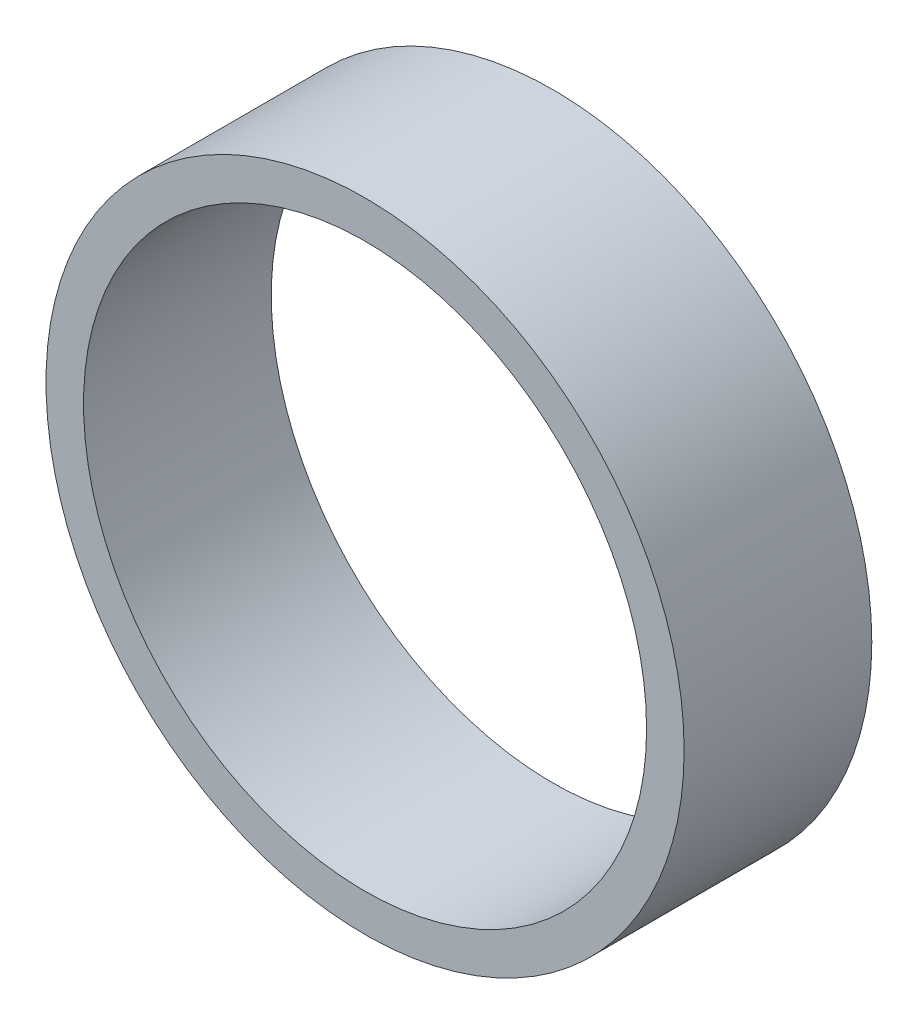
ISO-10303-21;
HEADER;
FILE_DESCRIPTION(('STEP AP214'),'2;1');
FILE_NAME('part.step','',(''),(''),'','','');
FILE_SCHEMA(('AUTOMOTIVE_DESIGN { 1 0 10303 214 1 1 1 1 }'));
ENDSEC;
DATA;
#1=APPLICATION_CONTEXT('core data for automotive mechanical design processes');
#2=APPLICATION_PROTOCOL_DEFINITION('international standard','automotive_design',2000,#1);
#3=PRODUCT_CONTEXT('',#1,'mechanical');
#4=PRODUCT('Part','Part','',(#3));
#5=PRODUCT_RELATED_PRODUCT_CATEGORY('part','',(#4));
#6=PRODUCT_DEFINITION_FORMATION('','',#4);
#7=PRODUCT_DEFINITION_CONTEXT('part definition',#1,'design');
#8=PRODUCT_DEFINITION('design','',#6,#7);
#9=PRODUCT_DEFINITION_SHAPE('','',#8);
#10=(LENGTH_UNIT() NAMED_UNIT(*) SI_UNIT(.MILLI.,.METRE.));
#11=(NAMED_UNIT(*) PLANE_ANGLE_UNIT() SI_UNIT($,.RADIAN.));
#12=(NAMED_UNIT(*) SI_UNIT($,.STERADIAN.) SOLID_ANGLE_UNIT());
#13=UNCERTAINTY_MEASURE_WITH_UNIT(LENGTH_MEASURE(1.E-05),#10,'distance_accuracy_value','');
#14=(GEOMETRIC_REPRESENTATION_CONTEXT(3) GLOBAL_UNCERTAINTY_ASSIGNED_CONTEXT((#13)) GLOBAL_UNIT_ASSIGNED_CONTEXT((#10,
#11,#12)) REPRESENTATION_CONTEXT('',''));
#15=CARTESIAN_POINT('',(0.,0.,0.));
#16=DIRECTION('',(0.,0.,1.));
#17=DIRECTION('',(1.,0.,0.));
#18=AXIS2_PLACEMENT_3D('',#15,#16,#17);
#19=CARTESIAN_POINT('',(0.,0.,50.));
#20=DIRECTION('',(0.,0.,1.));
#21=DIRECTION('',(1.,0.,0.));
#22=AXIS2_PLACEMENT_3D('',#19,#20,#21);
#23=PLANE('',#22);
#24=CARTESIAN_POINT('',(0.,0.,50.));
#25=DIRECTION('',(0.,0.,1.));
#26=DIRECTION('',(1.,0.,0.));
#27=AXIS2_PLACEMENT_3D('',#24,#25,#26);
#28=CIRCLE('',#27,85.);
#29=CARTESIAN_POINT('',(85.,0.,50.));
#30=VERTEX_POINT('',#29);
#31=EDGE_CURVE('E10',#30,#30,#28,.T.);
#32=ORIENTED_EDGE('',*,*,#31,.T.);
#33=EDGE_LOOP('',(#32));
#34=FACE_BOUND('',#33,.T.);
#35=CARTESIAN_POINT('',(0.,0.,50.));
#36=DIRECTION('',(0.,0.,1.));
#37=DIRECTION('',(1.,0.,0.));
#38=AXIS2_PLACEMENT_3D('',#35,#36,#37);
#39=CIRCLE('',#38,75.);
#40=CARTESIAN_POINT('',(75.,0.,50.));
#41=VERTEX_POINT('',#40);
#42=EDGE_CURVE('E50',#41,#41,#39,.T.);
#43=ORIENTED_EDGE('',*,*,#42,.F.);
#44=EDGE_LOOP('',(#43));
#45=FACE_BOUND('',#44,.T.);
#46=ADVANCED_FACE('F37',(#34,#45),#23,.T.);
#47=CARTESIAN_POINT('',(0.,0.,0.));
#48=DIRECTION('',(0.,0.,1.));
#49=DIRECTION('',(1.,0.,0.));
#50=AXIS2_PLACEMENT_3D('',#47,#48,#49);
#51=PLANE('',#50);
#52=CARTESIAN_POINT('',(0.,0.,0.));
#53=DIRECTION('',(0.,0.,1.));
#54=DIRECTION('',(1.,0.,0.));
#55=AXIS2_PLACEMENT_3D('',#52,#53,#54);
#56=CIRCLE('',#55,85.);
#57=CARTESIAN_POINT('',(85.,0.,0.));
#58=VERTEX_POINT('',#57);
#59=EDGE_CURVE('E41',#58,#58,#56,.T.);
#60=ORIENTED_EDGE('',*,*,#59,.F.);
#61=EDGE_LOOP('',(#60));
#62=FACE_BOUND('',#61,.T.);
#63=CARTESIAN_POINT('',(0.,0.,0.));
#64=DIRECTION('',(0.,0.,1.));
#65=DIRECTION('',(1.,0.,0.));
#66=AXIS2_PLACEMENT_3D('',#63,#64,#65);
#67=CIRCLE('',#66,75.);
#68=CARTESIAN_POINT('',(75.,0.,0.));
#69=VERTEX_POINT('',#68);
#70=EDGE_CURVE('E52',#69,#69,#67,.T.);
#71=ORIENTED_EDGE('',*,*,#70,.T.);
#72=EDGE_LOOP('',(#71));
#73=FACE_BOUND('',#72,.T.);
#74=ADVANCED_FACE('F64',(#62,#73),#51,.F.);
#75=CARTESIAN_POINT('',(0.,0.,50.));
#76=DIRECTION('',(0.,0.,-1.));
#77=DIRECTION('',(-1.,0.,0.));
#78=AXIS2_PLACEMENT_3D('',#75,#76,#77);
#79=CYLINDRICAL_SURFACE('',#78,85.);
#80=ORIENTED_EDGE('',*,*,#31,.F.);
#81=EDGE_LOOP('',(#80));
#82=FACE_BOUND('',#81,.T.);
#83=ORIENTED_EDGE('',*,*,#59,.T.);
#84=EDGE_LOOP('',(#83));
#85=FACE_BOUND('',#84,.T.);
#86=ADVANCED_FACE('F39',(#82,#85),#79,.T.);
#87=CARTESIAN_POINT('',(0.,0.,50.));
#88=DIRECTION('',(0.,0.,-1.));
#89=DIRECTION('',(-1.,0.,0.));
#90=AXIS2_PLACEMENT_3D('',#87,#88,#89);
#91=CYLINDRICAL_SURFACE('',#90,75.);
#92=ORIENTED_EDGE('',*,*,#42,.T.);
#93=EDGE_LOOP('',(#92));
#94=FACE_BOUND('',#93,.T.);
#95=ORIENTED_EDGE('',*,*,#70,.F.);
#96=EDGE_LOOP('',(#95));
#97=FACE_BOUND('',#96,.T.);
#98=ADVANCED_FACE('F60',(#94,#97),#91,.F.);
#99=CLOSED_SHELL('',(#46,#74,#86,#98));
#100=MANIFOLD_SOLID_BREP('B2',#99);
#101=ADVANCED_BREP_SHAPE_REPRESENTATION('',(#18,#100),#14);
#102=SHAPE_DEFINITION_REPRESENTATION(#9,#101);
ENDSEC;
END-ISO-10303-21;
